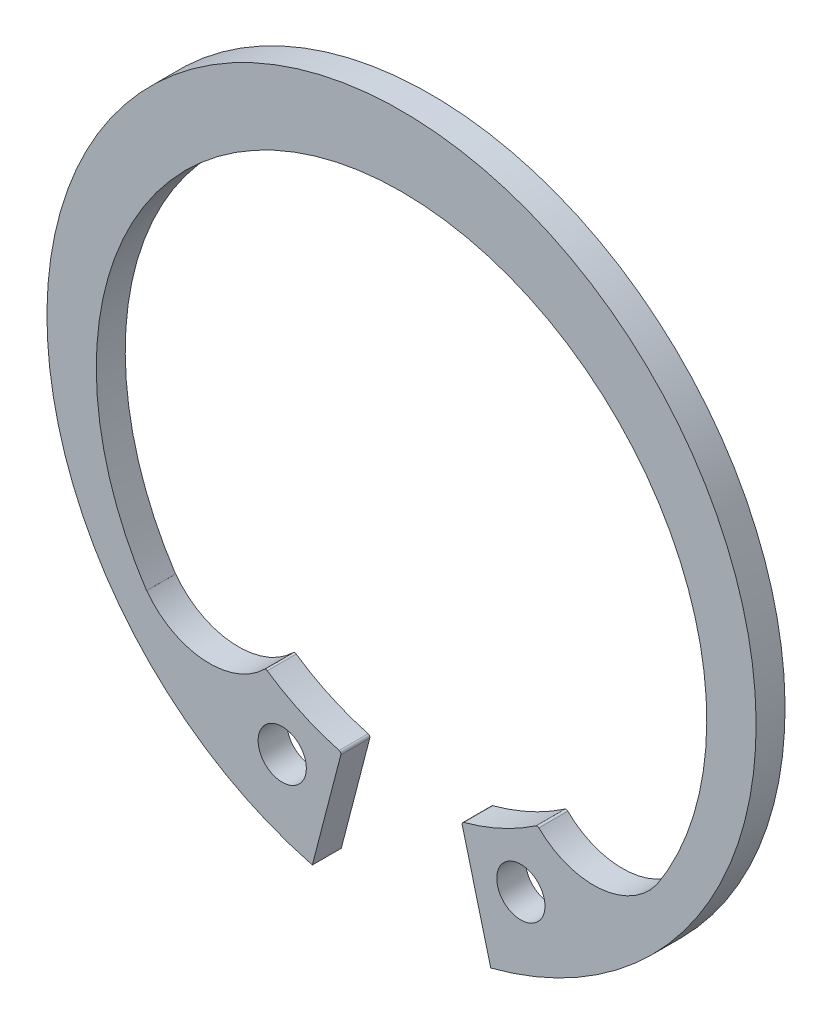
ISO-10303-21;
HEADER;
FILE_DESCRIPTION(('STEP AP214'),'2;1');
FILE_NAME('part.step','',(''),(''),'','','');
FILE_SCHEMA(('AUTOMOTIVE_DESIGN { 1 0 10303 214 1 1 1 1 }'));
ENDSEC;
DATA;
#1=APPLICATION_CONTEXT('core data for automotive mechanical design processes');
#2=APPLICATION_PROTOCOL_DEFINITION('international standard','automotive_design',2000,#1);
#3=PRODUCT_CONTEXT('',#1,'mechanical');
#4=PRODUCT('Part','Part','',(#3));
#5=PRODUCT_RELATED_PRODUCT_CATEGORY('part','',(#4));
#6=PRODUCT_DEFINITION_FORMATION('','',#4);
#7=PRODUCT_DEFINITION_CONTEXT('part definition',#1,'design');
#8=PRODUCT_DEFINITION('design','',#6,#7);
#9=PRODUCT_DEFINITION_SHAPE('','',#8);
#10=(LENGTH_UNIT() NAMED_UNIT(*) SI_UNIT(.MILLI.,.METRE.));
#11=(NAMED_UNIT(*) PLANE_ANGLE_UNIT() SI_UNIT($,.RADIAN.));
#12=(NAMED_UNIT(*) SI_UNIT($,.STERADIAN.) SOLID_ANGLE_UNIT());
#13=UNCERTAINTY_MEASURE_WITH_UNIT(LENGTH_MEASURE(1.E-05),#10,'distance_accuracy_value','');
#14=(GEOMETRIC_REPRESENTATION_CONTEXT(3) GLOBAL_UNCERTAINTY_ASSIGNED_CONTEXT((#13)) GLOBAL_UNIT_ASSIGNED_CONTEXT((#10,
#11,#12)) REPRESENTATION_CONTEXT('',''));
#15=CARTESIAN_POINT('',(0.,0.,0.));
#16=DIRECTION('',(0.,0.,1.));
#17=DIRECTION('',(1.,0.,0.));
#18=AXIS2_PLACEMENT_3D('',#15,#16,#17);
#19=CARTESIAN_POINT('',(0.,0.,-1.2));
#20=DIRECTION('',(0.,0.,1.));
#21=DIRECTION('',(1.,0.,0.));
#22=AXIS2_PLACEMENT_3D('',#19,#20,#21);
#23=CYLINDRICAL_SURFACE('',#22,14.7);
#24=CARTESIAN_POINT('',(0.,0.,-1.2));
#25=DIRECTION('',(0.,0.,1.));
#26=DIRECTION('',(1.,0.,0.));
#27=AXIS2_PLACEMENT_3D('',#24,#25,#26);
#28=CIRCLE('',#27,14.7);
#29=CARTESIAN_POINT('',(3.69832542704429,-14.2271708022248,-1.2));
#30=VERTEX_POINT('',#29);
#31=CARTESIAN_POINT('',(-3.69832542704429,-14.2271708022248,-1.2));
#32=VERTEX_POINT('',#31);
#33=EDGE_CURVE('E145',#30,#32,#28,.T.);
#34=ORIENTED_EDGE('',*,*,#33,.T.);
#35=DIRECTION('',(0.,0.,1.));
#36=VECTOR('',#35,1.);
#37=CARTESIAN_POINT('',(-3.69832542704429,-14.2271708022248,-1.2));
#38=LINE('',#37,#36);
#39=CARTESIAN_POINT('',(-3.69832542704429,-14.2271708022248,0.));
#40=VERTEX_POINT('',#39);
#41=EDGE_CURVE('E35',#32,#40,#38,.T.);
#42=ORIENTED_EDGE('',*,*,#41,.T.);
#43=CARTESIAN_POINT('',(0.,0.,0.));
#44=DIRECTION('',(0.,0.,1.));
#45=DIRECTION('',(1.,0.,0.));
#46=AXIS2_PLACEMENT_3D('',#43,#44,#45);
#47=CIRCLE('',#46,14.7);
#48=CARTESIAN_POINT('',(3.69832542704429,-14.2271708022248,0.));
#49=VERTEX_POINT('',#48);
#50=EDGE_CURVE('E56',#49,#40,#47,.T.);
#51=ORIENTED_EDGE('',*,*,#50,.F.);
#52=DIRECTION('',(0.,0.,1.));
#53=VECTOR('',#52,1.);
#54=CARTESIAN_POINT('',(3.69832542704429,-14.2271708022248,-1.2));
#55=LINE('',#54,#53);
#56=EDGE_CURVE('E11',#30,#49,#55,.T.);
#57=ORIENTED_EDGE('',*,*,#56,.F.);
#58=EDGE_LOOP('',(#34,#42,#51,#57));
#59=FACE_BOUND('',#58,.T.);
#60=ADVANCED_FACE('F32',(#59),#23,.T.);
#61=CARTESIAN_POINT('',(3.69832542704429,-14.2271708022248,-1.2));
#62=DIRECTION('',(-0.967834748450666,-0.251586763744509,0.));
#63=DIRECTION('',(0.251586763744509,-0.967834748450666,0.));
#64=AXIS2_PLACEMENT_3D('',#61,#62,#63);
#65=PLANE('',#64);
#66=DIRECTION('',(0.251586763744509,-0.967834748450666,0.));
#67=VECTOR('',#66,1.);
#68=CARTESIAN_POINT('',(3.69832542704429,-14.2271708022248,0.));
#69=LINE('',#68,#67);
#70=CARTESIAN_POINT('',(2.51574184091823,-9.6778635550339,0.));
#71=VERTEX_POINT('',#70);
#72=EDGE_CURVE('E248',#71,#49,#69,.T.);
#73=ORIENTED_EDGE('',*,*,#72,.F.);
#74=DIRECTION('',(0.,0.,1.));
#75=VECTOR('',#74,1.);
#76=CARTESIAN_POINT('',(2.51574184091823,-9.6778635550339,-1.2));
#77=LINE('',#76,#75);
#78=CARTESIAN_POINT('',(2.51574184091823,-9.6778635550339,-1.2));
#79=VERTEX_POINT('',#78);
#80=EDGE_CURVE('E221',#79,#71,#77,.T.);
#81=ORIENTED_EDGE('',*,*,#80,.F.);
#82=DIRECTION('',(0.251586763744509,-0.967834748450666,0.));
#83=VECTOR('',#82,1.);
#84=CARTESIAN_POINT('',(3.69832542704429,-14.2271708022248,-1.2));
#85=LINE('',#84,#83);
#86=EDGE_CURVE('E251',#79,#30,#85,.T.);
#87=ORIENTED_EDGE('',*,*,#86,.T.);
#88=ORIENTED_EDGE('',*,*,#56,.T.);
#89=EDGE_LOOP('',(#73,#81,#87,#88));
#90=FACE_BOUND('',#89,.T.);
#91=ADVANCED_FACE('F264',(#90),#65,.T.);
#92=CARTESIAN_POINT('',(0.,-0.854718275483989,-1.2));
#93=DIRECTION('',(0.,0.,1.));
#94=DIRECTION('',(1.,0.,0.));
#95=AXIS2_PLACEMENT_3D('',#92,#93,#94);
#96=CYLINDRICAL_SURFACE('',#95,12.654718275484);
#97=DIRECTION('',(0.,0.,1.));
#98=VECTOR('',#97,1.);
#99=CARTESIAN_POINT('',(-10.5686210689552,-7.81504465667514,-1.2));
#100=LINE('',#99,#98);
#101=CARTESIAN_POINT('',(-10.5686210689552,-7.81504465667514,-1.2));
#102=VERTEX_POINT('',#101);
#103=CARTESIAN_POINT('',(-10.5686210689552,-7.81504465667514,0.));
#104=VERTEX_POINT('',#103);
#105=EDGE_CURVE('E186',#102,#104,#100,.T.);
#106=ORIENTED_EDGE('',*,*,#105,.F.);
#107=CARTESIAN_POINT('',(0.,-0.854718275483989,-1.2));
#108=DIRECTION('',(0.,0.,-1.));
#109=DIRECTION('',(1.,0.,0.));
#110=AXIS2_PLACEMENT_3D('',#107,#108,#109);
#111=CIRCLE('',#110,12.654718275484);
#112=CARTESIAN_POINT('',(10.5686210689552,-7.81504465667514,-1.2));
#113=VERTEX_POINT('',#112);
#114=EDGE_CURVE('E64',#102,#113,#111,.T.);
#115=ORIENTED_EDGE('',*,*,#114,.T.);
#116=DIRECTION('',(0.,0.,1.));
#117=VECTOR('',#116,1.);
#118=CARTESIAN_POINT('',(10.5686210689552,-7.81504465667514,-1.2));
#119=LINE('',#118,#117);
#120=CARTESIAN_POINT('',(10.5686210689552,-7.81504465667514,0.));
#121=VERTEX_POINT('',#120);
#122=EDGE_CURVE('E224',#121,#113,#119,.F.);
#123=ORIENTED_EDGE('',*,*,#122,.F.);
#124=CARTESIAN_POINT('',(0.,-0.854718275483989,0.));
#125=DIRECTION('',(0.,0.,-1.));
#126=DIRECTION('',(1.,0.,0.));
#127=AXIS2_PLACEMENT_3D('',#124,#125,#126);
#128=CIRCLE('',#127,12.654718275484);
#129=EDGE_CURVE('E257',#104,#121,#128,.T.);
#130=ORIENTED_EDGE('',*,*,#129,.F.);
#131=EDGE_LOOP('',(#106,#115,#123,#130));
#132=FACE_BOUND('',#131,.T.);
#133=ADVANCED_FACE('F286',(#132),#96,.F.);
#134=CARTESIAN_POINT('',(-3.69832542704429,-14.2271708022248,-1.2));
#135=DIRECTION('',(0.967834748450666,-0.251586763744509,0.));
#136=DIRECTION('',(0.251586763744509,0.967834748450666,0.));
#137=AXIS2_PLACEMENT_3D('',#134,#135,#136);
#138=PLANE('',#137);
#139=DIRECTION('',(0.251586763744509,0.967834748450667,0.));
#140=VECTOR('',#139,1.);
#141=CARTESIAN_POINT('',(-3.69832542704429,-14.2271708022248,0.));
#142=LINE('',#141,#140);
#143=CARTESIAN_POINT('',(-2.51574184091823,-9.6778635550339,0.));
#144=VERTEX_POINT('',#143);
#145=EDGE_CURVE('E255',#40,#144,#142,.T.);
#146=ORIENTED_EDGE('',*,*,#145,.F.);
#147=ORIENTED_EDGE('',*,*,#41,.F.);
#148=DIRECTION('',(0.251586763744509,0.967834748450667,0.));
#149=VECTOR('',#148,1.);
#150=CARTESIAN_POINT('',(-3.69832542704429,-14.2271708022248,-1.2));
#151=LINE('',#150,#149);
#152=CARTESIAN_POINT('',(-2.51574184091823,-9.6778635550339,-1.2));
#153=VERTEX_POINT('',#152);
#154=EDGE_CURVE('E137',#32,#153,#151,.T.);
#155=ORIENTED_EDGE('',*,*,#154,.T.);
#156=DIRECTION('',(0.,0.,1.));
#157=VECTOR('',#156,1.);
#158=CARTESIAN_POINT('',(-2.51574184091823,-9.6778635550339,-1.2));
#159=LINE('',#158,#157);
#160=EDGE_CURVE('E141',#153,#144,#159,.T.);
#161=ORIENTED_EDGE('',*,*,#160,.T.);
#162=EDGE_LOOP('',(#146,#147,#155,#161));
#163=FACE_BOUND('',#162,.T.);
#164=ADVANCED_FACE('F140',(#163),#138,.T.);
#165=CARTESIAN_POINT('',(0.,0.,-1.2));
#166=DIRECTION('',(0.,0.,1.));
#167=DIRECTION('',(1.,0.,0.));
#168=AXIS2_PLACEMENT_3D('',#165,#166,#167);
#169=PLANE('',#168);
#170=ORIENTED_EDGE('',*,*,#114,.F.);
#171=DIRECTION('',(-0.804050474805392,-0.594561043094167,0.));
#172=VECTOR('',#171,1.);
#173=CARTESIAN_POINT('',(-11.8195419796393,-8.74004733348427,-1.2));
#174=LINE('',#173,#172);
#175=CARTESIAN_POINT('',(-10.5634463798531,-7.81121819472203,-1.2));
#176=VERTEX_POINT('',#175);
#177=EDGE_CURVE('E155',#176,#102,#174,.T.);
#178=ORIENTED_EDGE('',*,*,#177,.F.);
#179=CARTESIAN_POINT('',(-7.96009970057337,-5.88615432663226,-1.2));
#180=DIRECTION('',(0.,0.,-1.));
#181=DIRECTION('',(1.,0.,0.));
#182=AXIS2_PLACEMENT_3D('',#179,#180,#181);
#183=CIRCLE('',#182,3.23779011499222);
#184=CARTESIAN_POINT('',(-5.6931092712074,-8.19787213421701,-1.2));
#185=VERTEX_POINT('',#184);
#186=EDGE_CURVE('E172',#185,#176,#183,.T.);
#187=ORIENTED_EDGE('',*,*,#186,.F.);
#188=CARTESIAN_POINT('',(-5.62309267504606,-8.26927014722843,-1.2));
#189=DIRECTION('',(0.,0.,1.));
#190=DIRECTION('',(1.,0.,0.));
#191=AXIS2_PLACEMENT_3D('',#188,#189,#190);
#192=CIRCLE('',#191,0.0999999999999979);
#193=CARTESIAN_POINT('',(-5.5668617482956,-8.18657744575615,-1.2));
#194=VERTEX_POINT('',#193);
#195=EDGE_CURVE('E164',#194,#185,#192,.T.);
#196=ORIENTED_EDGE('',*,*,#195,.F.);
#197=CARTESIAN_POINT('',(0.,0.,-1.2));
#198=DIRECTION('',(0.,0.,-1.));
#199=DIRECTION('',(1.,0.,0.));
#200=AXIS2_PLACEMENT_3D('',#197,#198,#199);
#201=CIRCLE('',#200,9.9);
#202=CARTESIAN_POINT('',(-2.58640006260566,-9.55617782987285,-1.2));
#203=VERTEX_POINT('',#202);
#204=EDGE_CURVE('E160',#203,#194,#201,.T.);
#205=ORIENTED_EDGE('',*,*,#204,.F.);
#206=CARTESIAN_POINT('',(-2.6125253157633,-9.65270487865945,-1.2));
#207=DIRECTION('',(0.,0.,1.));
#208=DIRECTION('',(-1.,0.,0.));
#209=AXIS2_PLACEMENT_3D('',#206,#207,#208);
#210=CIRCLE('',#209,0.0999999999999992);
#211=EDGE_CURVE('E151',#153,#203,#210,.T.);
#212=ORIENTED_EDGE('',*,*,#211,.F.);
#213=ORIENTED_EDGE('',*,*,#154,.F.);
#214=ORIENTED_EDGE('',*,*,#33,.F.);
#215=ORIENTED_EDGE('',*,*,#86,.F.);
#216=CARTESIAN_POINT('',(2.61252531576329,-9.65270487865945,-1.2));
#217=DIRECTION('',(0.,0.,1.));
#218=DIRECTION('',(1.,0.,0.));
#219=AXIS2_PLACEMENT_3D('',#216,#217,#218);
#220=CIRCLE('',#219,0.1);
#221=CARTESIAN_POINT('',(2.58640006260566,-9.55617782987285,-1.2));
#222=VERTEX_POINT('',#221);
#223=EDGE_CURVE('E206',#222,#79,#220,.T.);
#224=ORIENTED_EDGE('',*,*,#223,.F.);
#225=CARTESIAN_POINT('',(0.,0.,-1.2));
#226=DIRECTION('',(0.,0.,-1.));
#227=DIRECTION('',(1.,0.,0.));
#228=AXIS2_PLACEMENT_3D('',#225,#226,#227);
#229=CIRCLE('',#228,9.9);
#230=CARTESIAN_POINT('',(5.5668617482956,-8.18657744575615,-1.2));
#231=VERTEX_POINT('',#230);
#232=EDGE_CURVE('E204',#231,#222,#229,.T.);
#233=ORIENTED_EDGE('',*,*,#232,.F.);
#234=CARTESIAN_POINT('',(5.62309267504606,-8.26927014722843,-1.2));
#235=DIRECTION('',(0.,0.,1.));
#236=DIRECTION('',(-1.,0.,0.));
#237=AXIS2_PLACEMENT_3D('',#234,#235,#236);
#238=CIRCLE('',#237,0.0999999999999979);
#239=CARTESIAN_POINT('',(5.6931092712074,-8.19787213421701,-1.2));
#240=VERTEX_POINT('',#239);
#241=EDGE_CURVE('E201',#240,#231,#238,.T.);
#242=ORIENTED_EDGE('',*,*,#241,.F.);
#243=CARTESIAN_POINT('',(7.96009970057337,-5.88615432663226,-1.2));
#244=DIRECTION('',(0.,0.,-1.));
#245=DIRECTION('',(1.,0.,0.));
#246=AXIS2_PLACEMENT_3D('',#243,#244,#245);
#247=CIRCLE('',#246,3.23779011499222);
#248=CARTESIAN_POINT('',(10.5634463798531,-7.81121819472203,-1.2));
#249=VERTEX_POINT('',#248);
#250=EDGE_CURVE('E197',#249,#240,#247,.T.);
#251=ORIENTED_EDGE('',*,*,#250,.F.);
#252=DIRECTION('',(-0.804050474805392,0.594561043094167,0.));
#253=VECTOR('',#252,1.);
#254=CARTESIAN_POINT('',(10.5634463798531,-7.81121819472203,-1.2));
#255=LINE('',#254,#253);
#256=EDGE_CURVE('E195',#113,#249,#255,.T.);
#257=ORIENTED_EDGE('',*,*,#256,.F.);
#258=EDGE_LOOP('',(#170,#178,#187,#196,#205,#212,#213,#214,#215,#224,#233,#242,#251,#257));
#259=FACE_BOUND('',#258,.T.);
#260=CARTESIAN_POINT('',(4.94595449661962,-10.8784205708994,-1.2));
#261=DIRECTION('',(0.,0.,1.));
#262=DIRECTION('',(1.,0.,0.));
#263=AXIS2_PLACEMENT_3D('',#260,#261,#262);
#264=CIRCLE('',#263,1.);
#265=CARTESIAN_POINT('',(5.94595449661962,-10.8784205708994,-1.2));
#266=VERTEX_POINT('',#265);
#267=EDGE_CURVE('E243',#266,#266,#264,.T.);
#268=ORIENTED_EDGE('',*,*,#267,.T.);
#269=EDGE_LOOP('',(#268));
#270=FACE_BOUND('',#269,.T.);
#271=CARTESIAN_POINT('',(-4.94595449661962,-10.8784205708994,-1.2));
#272=DIRECTION('',(0.,0.,1.));
#273=DIRECTION('',(1.,0.,0.));
#274=AXIS2_PLACEMENT_3D('',#271,#272,#273);
#275=CIRCLE('',#274,1.);
#276=CARTESIAN_POINT('',(-3.94595449661962,-10.8784205708994,-1.2));
#277=VERTEX_POINT('',#276);
#278=EDGE_CURVE('E237',#277,#277,#275,.T.);
#279=ORIENTED_EDGE('',*,*,#278,.T.);
#280=EDGE_LOOP('',(#279));
#281=FACE_BOUND('',#280,.T.);
#282=ADVANCED_FACE('F157',(#259,#270,#281),#169,.F.);
#283=CARTESIAN_POINT('',(0.,0.,0.));
#284=DIRECTION('',(0.,0.,1.));
#285=DIRECTION('',(1.,0.,0.));
#286=AXIS2_PLACEMENT_3D('',#283,#284,#285);
#287=PLANE('',#286);
#288=DIRECTION('',(-0.804050474805392,-0.594561043094167,0.));
#289=VECTOR('',#288,1.);
#290=CARTESIAN_POINT('',(-11.8195419796393,-8.74004733348427,0.));
#291=LINE('',#290,#289);
#292=CARTESIAN_POINT('',(-10.5634463798531,-7.81121819472203,0.));
#293=VERTEX_POINT('',#292);
#294=EDGE_CURVE('E162',#293,#104,#291,.T.);
#295=ORIENTED_EDGE('',*,*,#294,.T.);
#296=ORIENTED_EDGE('',*,*,#129,.T.);
#297=DIRECTION('',(-0.804050474805392,0.594561043094167,0.));
#298=VECTOR('',#297,1.);
#299=CARTESIAN_POINT('',(10.5634463798531,-7.81121819472203,0.));
#300=LINE('',#299,#298);
#301=CARTESIAN_POINT('',(10.5634463798531,-7.81121819472203,0.));
#302=VERTEX_POINT('',#301);
#303=EDGE_CURVE('E194',#121,#302,#300,.T.);
#304=ORIENTED_EDGE('',*,*,#303,.T.);
#305=CARTESIAN_POINT('',(7.96009970057337,-5.88615432663226,0.));
#306=DIRECTION('',(0.,0.,-1.));
#307=DIRECTION('',(1.,0.,0.));
#308=AXIS2_PLACEMENT_3D('',#305,#306,#307);
#309=CIRCLE('',#308,3.23779011499222);
#310=CARTESIAN_POINT('',(5.6931092712074,-8.19787213421701,0.));
#311=VERTEX_POINT('',#310);
#312=EDGE_CURVE('E211',#302,#311,#309,.T.);
#313=ORIENTED_EDGE('',*,*,#312,.T.);
#314=CARTESIAN_POINT('',(5.62309267504606,-8.26927014722843,0.));
#315=DIRECTION('',(0.,0.,1.));
#316=DIRECTION('',(-1.,0.,0.));
#317=AXIS2_PLACEMENT_3D('',#314,#315,#316);
#318=CIRCLE('',#317,0.0999999999999979);
#319=CARTESIAN_POINT('',(5.5668617482956,-8.18657744575615,0.));
#320=VERTEX_POINT('',#319);
#321=EDGE_CURVE('E214',#311,#320,#318,.T.);
#322=ORIENTED_EDGE('',*,*,#321,.T.);
#323=CARTESIAN_POINT('',(0.,0.,0.));
#324=DIRECTION('',(0.,0.,-1.));
#325=DIRECTION('',(1.,0.,0.));
#326=AXIS2_PLACEMENT_3D('',#323,#324,#325);
#327=CIRCLE('',#326,9.9);
#328=CARTESIAN_POINT('',(2.58640006260566,-9.55617782987285,0.));
#329=VERTEX_POINT('',#328);
#330=EDGE_CURVE('E217',#320,#329,#327,.T.);
#331=ORIENTED_EDGE('',*,*,#330,.T.);
#332=CARTESIAN_POINT('',(2.61252531576329,-9.65270487865945,0.));
#333=DIRECTION('',(0.,0.,1.));
#334=DIRECTION('',(1.,0.,0.));
#335=AXIS2_PLACEMENT_3D('',#332,#333,#334);
#336=CIRCLE('',#335,0.1);
#337=EDGE_CURVE('E198',#329,#71,#336,.T.);
#338=ORIENTED_EDGE('',*,*,#337,.T.);
#339=ORIENTED_EDGE('',*,*,#72,.T.);
#340=ORIENTED_EDGE('',*,*,#50,.T.);
#341=ORIENTED_EDGE('',*,*,#145,.T.);
#342=CARTESIAN_POINT('',(-2.6125253157633,-9.65270487865945,0.));
#343=DIRECTION('',(0.,0.,1.));
#344=DIRECTION('',(-1.,0.,0.));
#345=AXIS2_PLACEMENT_3D('',#342,#343,#344);
#346=CIRCLE('',#345,0.0999999999999992);
#347=CARTESIAN_POINT('',(-2.58640006260566,-9.55617782987285,0.));
#348=VERTEX_POINT('',#347);
#349=EDGE_CURVE('E153',#144,#348,#346,.T.);
#350=ORIENTED_EDGE('',*,*,#349,.T.);
#351=CARTESIAN_POINT('',(0.,0.,0.));
#352=DIRECTION('',(0.,0.,-1.));
#353=DIRECTION('',(1.,0.,0.));
#354=AXIS2_PLACEMENT_3D('',#351,#352,#353);
#355=CIRCLE('',#354,9.9);
#356=CARTESIAN_POINT('',(-5.5668617482956,-8.18657744575615,0.));
#357=VERTEX_POINT('',#356);
#358=EDGE_CURVE('E177',#348,#357,#355,.T.);
#359=ORIENTED_EDGE('',*,*,#358,.T.);
#360=CARTESIAN_POINT('',(-5.62309267504606,-8.26927014722843,0.));
#361=DIRECTION('',(0.,0.,1.));
#362=DIRECTION('',(1.,0.,0.));
#363=AXIS2_PLACEMENT_3D('',#360,#361,#362);
#364=CIRCLE('',#363,0.0999999999999979);
#365=CARTESIAN_POINT('',(-5.6931092712074,-8.19787213421701,0.));
#366=VERTEX_POINT('',#365);
#367=EDGE_CURVE('E179',#357,#366,#364,.T.);
#368=ORIENTED_EDGE('',*,*,#367,.T.);
#369=CARTESIAN_POINT('',(-7.96009970057337,-5.88615432663226,0.));
#370=DIRECTION('',(0.,0.,-1.));
#371=DIRECTION('',(1.,0.,0.));
#372=AXIS2_PLACEMENT_3D('',#369,#370,#371);
#373=CIRCLE('',#372,3.23779011499222);
#374=EDGE_CURVE('E167',#366,#293,#373,.T.);
#375=ORIENTED_EDGE('',*,*,#374,.T.);
#376=EDGE_LOOP('',(#295,#296,#304,#313,#322,#331,#338,#339,#340,#341,#350,#359,#368,#375));
#377=FACE_BOUND('',#376,.T.);
#378=CARTESIAN_POINT('',(4.94595449661962,-10.8784205708994,0.));
#379=DIRECTION('',(0.,0.,1.));
#380=DIRECTION('',(1.,0.,0.));
#381=AXIS2_PLACEMENT_3D('',#378,#379,#380);
#382=CIRCLE('',#381,1.);
#383=CARTESIAN_POINT('',(5.94595449661962,-10.8784205708994,0.));
#384=VERTEX_POINT('',#383);
#385=EDGE_CURVE('E240',#384,#384,#382,.T.);
#386=ORIENTED_EDGE('',*,*,#385,.F.);
#387=EDGE_LOOP('',(#386));
#388=FACE_BOUND('',#387,.T.);
#389=CARTESIAN_POINT('',(-4.94595449661962,-10.8784205708994,0.));
#390=DIRECTION('',(0.,0.,1.));
#391=DIRECTION('',(1.,0.,0.));
#392=AXIS2_PLACEMENT_3D('',#389,#390,#391);
#393=CIRCLE('',#392,1.);
#394=CARTESIAN_POINT('',(-3.94595449661962,-10.8784205708994,0.));
#395=VERTEX_POINT('',#394);
#396=EDGE_CURVE('E236',#395,#395,#393,.T.);
#397=ORIENTED_EDGE('',*,*,#396,.F.);
#398=EDGE_LOOP('',(#397));
#399=FACE_BOUND('',#398,.T.);
#400=ADVANCED_FACE('F259',(#377,#388,#399),#287,.T.);
#401=CARTESIAN_POINT('',(4.94595449661962,-10.8784205708994,-1.2));
#402=DIRECTION('',(0.,0.,1.));
#403=DIRECTION('',(1.,0.,0.));
#404=AXIS2_PLACEMENT_3D('',#401,#402,#403);
#405=CYLINDRICAL_SURFACE('',#404,1.);
#406=ORIENTED_EDGE('',*,*,#267,.F.);
#407=EDGE_LOOP('',(#406));
#408=FACE_BOUND('',#407,.T.);
#409=ORIENTED_EDGE('',*,*,#385,.T.);
#410=EDGE_LOOP('',(#409));
#411=FACE_BOUND('',#410,.T.);
#412=ADVANCED_FACE('F309',(#408,#411),#405,.F.);
#413=CARTESIAN_POINT('',(-4.94595449661962,-10.8784205708994,-1.2));
#414=DIRECTION('',(0.,0.,1.));
#415=DIRECTION('',(1.,0.,0.));
#416=AXIS2_PLACEMENT_3D('',#413,#414,#415);
#417=CYLINDRICAL_SURFACE('',#416,1.);
#418=ORIENTED_EDGE('',*,*,#278,.F.);
#419=EDGE_LOOP('',(#418));
#420=FACE_BOUND('',#419,.T.);
#421=ORIENTED_EDGE('',*,*,#396,.T.);
#422=EDGE_LOOP('',(#421));
#423=FACE_BOUND('',#422,.T.);
#424=ADVANCED_FACE('F302',(#420,#423),#417,.F.);
#425=CARTESIAN_POINT('',(0.,0.,-1.2));
#426=DIRECTION('',(0.,0.,1.));
#427=DIRECTION('',(1.,0.,0.));
#428=AXIS2_PLACEMENT_3D('',#425,#426,#427);
#429=CYLINDRICAL_SURFACE('',#428,9.9);
#430=ORIENTED_EDGE('',*,*,#330,.F.);
#431=DIRECTION('',(0.,0.,1.));
#432=VECTOR('',#431,1.);
#433=CARTESIAN_POINT('',(5.5668617482956,-8.18657744575615,-1.2));
#434=LINE('',#433,#432);
#435=EDGE_CURVE('E228',#231,#320,#434,.T.);
#436=ORIENTED_EDGE('',*,*,#435,.F.);
#437=ORIENTED_EDGE('',*,*,#232,.T.);
#438=DIRECTION('',(0.,0.,1.));
#439=VECTOR('',#438,1.);
#440=CARTESIAN_POINT('',(2.58640006260566,-9.55617782987285,-1.2));
#441=LINE('',#440,#439);
#442=EDGE_CURVE('E225',#222,#329,#441,.T.);
#443=ORIENTED_EDGE('',*,*,#442,.T.);
#444=EDGE_LOOP('',(#430,#436,#437,#443));
#445=FACE_BOUND('',#444,.T.);
#446=ADVANCED_FACE('F300',(#445),#429,.F.);
#447=CARTESIAN_POINT('',(2.61252531576329,-9.65270487865945,-1.2));
#448=DIRECTION('',(0.,0.,1.));
#449=DIRECTION('',(1.,0.,0.));
#450=AXIS2_PLACEMENT_3D('',#447,#448,#449);
#451=CYLINDRICAL_SURFACE('',#450,0.1);
#452=ORIENTED_EDGE('',*,*,#337,.F.);
#453=ORIENTED_EDGE('',*,*,#442,.F.);
#454=ORIENTED_EDGE('',*,*,#223,.T.);
#455=ORIENTED_EDGE('',*,*,#80,.T.);
#456=EDGE_LOOP('',(#452,#453,#454,#455));
#457=FACE_BOUND('',#456,.T.);
#458=ADVANCED_FACE('F266',(#457),#451,.T.);
#459=CARTESIAN_POINT('',(5.62309267504606,-8.26927014722843,-1.2));
#460=DIRECTION('',(0.,0.,1.));
#461=DIRECTION('',(1.,0.,0.));
#462=AXIS2_PLACEMENT_3D('',#459,#460,#461);
#463=CYLINDRICAL_SURFACE('',#462,0.0999999999999979);
#464=ORIENTED_EDGE('',*,*,#321,.F.);
#465=DIRECTION('',(0.,0.,1.));
#466=VECTOR('',#465,1.);
#467=CARTESIAN_POINT('',(5.6931092712074,-8.19787213421701,-1.2));
#468=LINE('',#467,#466);
#469=EDGE_CURVE('E231',#240,#311,#468,.T.);
#470=ORIENTED_EDGE('',*,*,#469,.F.);
#471=ORIENTED_EDGE('',*,*,#241,.T.);
#472=ORIENTED_EDGE('',*,*,#435,.T.);
#473=EDGE_LOOP('',(#464,#470,#471,#472));
#474=FACE_BOUND('',#473,.T.);
#475=ADVANCED_FACE('F298',(#474),#463,.T.);
#476=CARTESIAN_POINT('',(7.96009970057337,-5.88615432663226,-1.2));
#477=DIRECTION('',(0.,0.,1.));
#478=DIRECTION('',(1.,0.,0.));
#479=AXIS2_PLACEMENT_3D('',#476,#477,#478);
#480=CYLINDRICAL_SURFACE('',#479,3.23779011499222);
#481=ORIENTED_EDGE('',*,*,#312,.F.);
#482=DIRECTION('',(0.,0.,1.));
#483=VECTOR('',#482,1.);
#484=CARTESIAN_POINT('',(10.5634463798531,-7.81121819472203,-1.2));
#485=LINE('',#484,#483);
#486=EDGE_CURVE('E209',#249,#302,#485,.T.);
#487=ORIENTED_EDGE('',*,*,#486,.F.);
#488=ORIENTED_EDGE('',*,*,#250,.T.);
#489=ORIENTED_EDGE('',*,*,#469,.T.);
#490=EDGE_LOOP('',(#481,#487,#488,#489));
#491=FACE_BOUND('',#490,.T.);
#492=ADVANCED_FACE('F295',(#491),#480,.F.);
#493=CARTESIAN_POINT('',(10.5634463798531,-7.81121819472203,-1.2));
#494=DIRECTION('',(0.594561043094167,0.804050474805391,0.));
#495=DIRECTION('',(-0.804050474805392,0.594561043094167,0.));
#496=AXIS2_PLACEMENT_3D('',#493,#494,#495);
#497=PLANE('',#496);
#498=ORIENTED_EDGE('',*,*,#303,.F.);
#499=ORIENTED_EDGE('',*,*,#122,.T.);
#500=ORIENTED_EDGE('',*,*,#256,.T.);
#501=ORIENTED_EDGE('',*,*,#486,.T.);
#502=EDGE_LOOP('',(#498,#499,#500,#501));
#503=FACE_BOUND('',#502,.T.);
#504=ADVANCED_FACE('F292',(#503),#497,.T.);
#505=CARTESIAN_POINT('',(0.,0.,-1.2));
#506=DIRECTION('',(0.,0.,1.));
#507=DIRECTION('',(1.,0.,0.));
#508=AXIS2_PLACEMENT_3D('',#505,#506,#507);
#509=CYLINDRICAL_SURFACE('',#508,9.9);
#510=ORIENTED_EDGE('',*,*,#358,.F.);
#511=DIRECTION('',(0.,0.,1.));
#512=VECTOR('',#511,1.);
#513=CARTESIAN_POINT('',(-2.58640006260566,-9.55617782987285,-1.2));
#514=LINE('',#513,#512);
#515=EDGE_CURVE('E154',#203,#348,#514,.T.);
#516=ORIENTED_EDGE('',*,*,#515,.F.);
#517=ORIENTED_EDGE('',*,*,#204,.T.);
#518=DIRECTION('',(0.,0.,1.));
#519=VECTOR('',#518,1.);
#520=CARTESIAN_POINT('',(-5.5668617482956,-8.18657744575615,-1.2));
#521=LINE('',#520,#519);
#522=EDGE_CURVE('E189',#194,#357,#521,.T.);
#523=ORIENTED_EDGE('',*,*,#522,.T.);
#524=EDGE_LOOP('',(#510,#516,#517,#523));
#525=FACE_BOUND('',#524,.T.);
#526=ADVANCED_FACE('F274',(#525),#509,.F.);
#527=CARTESIAN_POINT('',(-11.8195419796393,-8.74004733348427,-1.2));
#528=DIRECTION('',(-0.594561043094167,0.804050474805391,0.));
#529=DIRECTION('',(-0.804050474805392,-0.594561043094167,0.));
#530=AXIS2_PLACEMENT_3D('',#527,#528,#529);
#531=PLANE('',#530);
#532=ORIENTED_EDGE('',*,*,#177,.T.);
#533=ORIENTED_EDGE('',*,*,#105,.T.);
#534=ORIENTED_EDGE('',*,*,#294,.F.);
#535=DIRECTION('',(0.,0.,1.));
#536=VECTOR('',#535,1.);
#537=CARTESIAN_POINT('',(-10.5634463798531,-7.81121819472203,-1.2));
#538=LINE('',#537,#536);
#539=EDGE_CURVE('E184',#176,#293,#538,.T.);
#540=ORIENTED_EDGE('',*,*,#539,.F.);
#541=EDGE_LOOP('',(#532,#533,#534,#540));
#542=FACE_BOUND('',#541,.T.);
#543=ADVANCED_FACE('F284',(#542),#531,.T.);
#544=CARTESIAN_POINT('',(-7.96009970057337,-5.88615432663226,-1.2));
#545=DIRECTION('',(0.,0.,1.));
#546=DIRECTION('',(1.,0.,0.));
#547=AXIS2_PLACEMENT_3D('',#544,#545,#546);
#548=CYLINDRICAL_SURFACE('',#547,3.23779011499222);
#549=ORIENTED_EDGE('',*,*,#374,.F.);
#550=DIRECTION('',(0.,0.,1.));
#551=VECTOR('',#550,1.);
#552=CARTESIAN_POINT('',(-5.6931092712074,-8.19787213421701,-1.2));
#553=LINE('',#552,#551);
#554=EDGE_CURVE('E187',#185,#366,#553,.T.);
#555=ORIENTED_EDGE('',*,*,#554,.F.);
#556=ORIENTED_EDGE('',*,*,#186,.T.);
#557=ORIENTED_EDGE('',*,*,#539,.T.);
#558=EDGE_LOOP('',(#549,#555,#556,#557));
#559=FACE_BOUND('',#558,.T.);
#560=ADVANCED_FACE('F280',(#559),#548,.F.);
#561=CARTESIAN_POINT('',(-5.62309267504606,-8.26927014722843,-1.2));
#562=DIRECTION('',(0.,0.,1.));
#563=DIRECTION('',(1.,0.,0.));
#564=AXIS2_PLACEMENT_3D('',#561,#562,#563);
#565=CYLINDRICAL_SURFACE('',#564,0.0999999999999979);
#566=ORIENTED_EDGE('',*,*,#367,.F.);
#567=ORIENTED_EDGE('',*,*,#522,.F.);
#568=ORIENTED_EDGE('',*,*,#195,.T.);
#569=ORIENTED_EDGE('',*,*,#554,.T.);
#570=EDGE_LOOP('',(#566,#567,#568,#569));
#571=FACE_BOUND('',#570,.T.);
#572=ADVANCED_FACE('F276',(#571),#565,.T.);
#573=CARTESIAN_POINT('',(-2.6125253157633,-9.65270487865945,-1.2));
#574=DIRECTION('',(0.,0.,1.));
#575=DIRECTION('',(1.,0.,0.));
#576=AXIS2_PLACEMENT_3D('',#573,#574,#575);
#577=CYLINDRICAL_SURFACE('',#576,0.0999999999999992);
#578=ORIENTED_EDGE('',*,*,#349,.F.);
#579=ORIENTED_EDGE('',*,*,#160,.F.);
#580=ORIENTED_EDGE('',*,*,#211,.T.);
#581=ORIENTED_EDGE('',*,*,#515,.T.);
#582=EDGE_LOOP('',(#578,#579,#580,#581));
#583=FACE_BOUND('',#582,.T.);
#584=ADVANCED_FACE('F149',(#583),#577,.T.);
#585=CLOSED_SHELL('',(#60,#91,#133,#164,#282,#400,#412,#424,#446,#458,#475,#492,#504,#526,#543,
#560,#572,#584));
#586=MANIFOLD_SOLID_BREP('B2',#585);
#587=ADVANCED_BREP_SHAPE_REPRESENTATION('',(#18,#586),#14);
#588=SHAPE_DEFINITION_REPRESENTATION(#9,#587);
ENDSEC;
END-ISO-10303-21;
